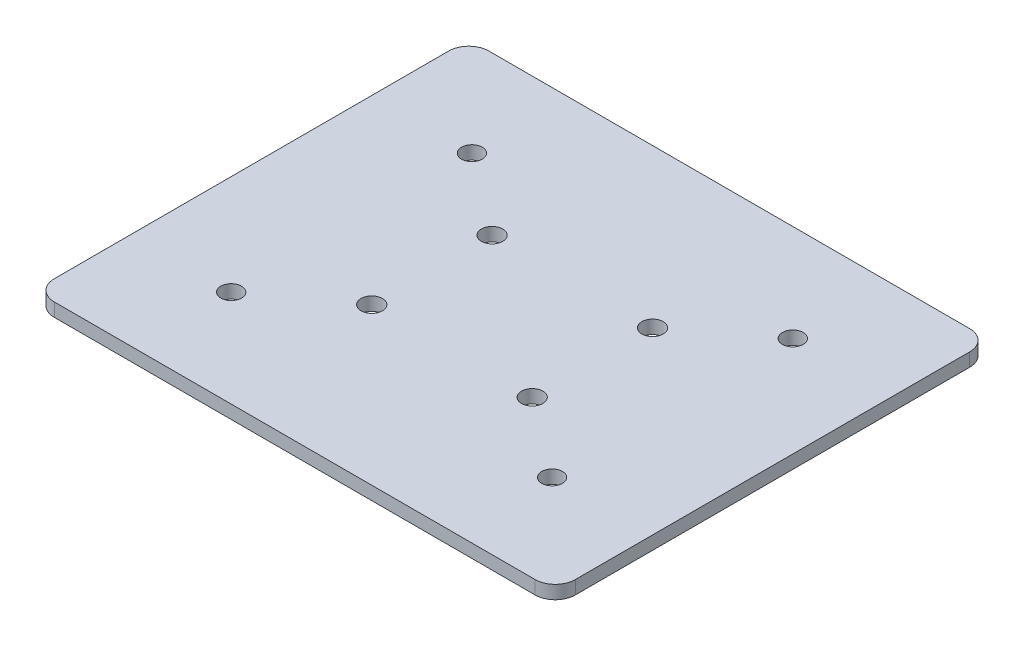
ISO-10303-21;
HEADER;
FILE_DESCRIPTION(('STEP AP214'),'2;1');
FILE_NAME('part.step','',(''),(''),'','','');
FILE_SCHEMA(('AUTOMOTIVE_DESIGN { 1 0 10303 214 1 1 1 1 }'));
ENDSEC;
DATA;
#1=APPLICATION_CONTEXT('core data for automotive mechanical design processes');
#2=APPLICATION_PROTOCOL_DEFINITION('international standard','automotive_design',2000,#1);
#3=PRODUCT_CONTEXT('',#1,'mechanical');
#4=PRODUCT('Part','Part','',(#3));
#5=PRODUCT_RELATED_PRODUCT_CATEGORY('part','',(#4));
#6=PRODUCT_DEFINITION_FORMATION('','',#4);
#7=PRODUCT_DEFINITION_CONTEXT('part definition',#1,'design');
#8=PRODUCT_DEFINITION('design','',#6,#7);
#9=PRODUCT_DEFINITION_SHAPE('','',#8);
#10=(LENGTH_UNIT() NAMED_UNIT(*) SI_UNIT(.MILLI.,.METRE.));
#11=(NAMED_UNIT(*) PLANE_ANGLE_UNIT() SI_UNIT($,.RADIAN.));
#12=(NAMED_UNIT(*) SI_UNIT($,.STERADIAN.) SOLID_ANGLE_UNIT());
#13=UNCERTAINTY_MEASURE_WITH_UNIT(LENGTH_MEASURE(1.E-05),#10,'distance_accuracy_value','');
#14=(GEOMETRIC_REPRESENTATION_CONTEXT(3) GLOBAL_UNCERTAINTY_ASSIGNED_CONTEXT((#13)) GLOBAL_UNIT_ASSIGNED_CONTEXT((#10,
#11,#12)) REPRESENTATION_CONTEXT('',''));
#15=CARTESIAN_POINT('',(0.,0.,0.));
#16=DIRECTION('',(0.,0.,1.));
#17=DIRECTION('',(1.,0.,0.));
#18=AXIS2_PLACEMENT_3D('',#15,#16,#17);
#19=CARTESIAN_POINT('',(-38.9641351282005,2.,32.5));
#20=DIRECTION('',(-1.,0.,0.));
#21=DIRECTION('',(0.,0.,1.));
#22=AXIS2_PLACEMENT_3D('',#19,#20,#21);
#23=PLANE('',#22);
#24=DIRECTION('',(0.,0.,-1.));
#25=VECTOR('',#24,1.);
#26=CARTESIAN_POINT('',(-38.9641351282005,0.,32.5));
#27=LINE('',#26,#25);
#28=CARTESIAN_POINT('',(-38.9641351282005,0.,29.5));
#29=VERTEX_POINT('',#28);
#30=CARTESIAN_POINT('',(-38.9641351282005,0.,-29.5));
#31=VERTEX_POINT('',#30);
#32=EDGE_CURVE('E190',#29,#31,#27,.T.);
#33=ORIENTED_EDGE('',*,*,#32,.F.);
#34=DIRECTION('',(0.,-1.,0.));
#35=VECTOR('',#34,1.);
#36=CARTESIAN_POINT('',(-38.9641351282005,2.,29.5));
#37=LINE('',#36,#35);
#38=CARTESIAN_POINT('',(-38.9641351282005,2.,29.5));
#39=VERTEX_POINT('',#38);
#40=EDGE_CURVE('E111',#29,#39,#37,.F.);
#41=ORIENTED_EDGE('',*,*,#40,.T.);
#42=DIRECTION('',(0.,0.,-1.));
#43=VECTOR('',#42,1.);
#44=CARTESIAN_POINT('',(-38.9641351282005,2.,32.5));
#45=LINE('',#44,#43);
#46=CARTESIAN_POINT('',(-38.9641351282005,2.,-29.5));
#47=VERTEX_POINT('',#46);
#48=EDGE_CURVE('E135',#39,#47,#45,.T.);
#49=ORIENTED_EDGE('',*,*,#48,.T.);
#50=DIRECTION('',(0.,-1.,0.));
#51=VECTOR('',#50,1.);
#52=CARTESIAN_POINT('',(-38.9641351282005,2.,-29.5));
#53=LINE('',#52,#51);
#54=EDGE_CURVE('E117',#47,#31,#53,.T.);
#55=ORIENTED_EDGE('',*,*,#54,.T.);
#56=EDGE_LOOP('',(#33,#41,#49,#55));
#57=FACE_BOUND('',#56,.T.);
#58=ADVANCED_FACE('F39',(#57),#23,.T.);
#59=CARTESIAN_POINT('',(-38.9641351282005,2.,32.5));
#60=DIRECTION('',(0.,0.,-1.));
#61=DIRECTION('',(-1.,0.,0.));
#62=AXIS2_PLACEMENT_3D('',#59,#60,#61);
#63=PLANE('',#62);
#64=DIRECTION('',(1.,0.,0.));
#65=VECTOR('',#64,1.);
#66=CARTESIAN_POINT('',(-38.9641351282005,2.,32.5));
#67=LINE('',#66,#65);
#68=CARTESIAN_POINT('',(-35.9641351282005,2.,32.5));
#69=VERTEX_POINT('',#68);
#70=CARTESIAN_POINT('',(35.9641351282005,2.,32.5));
#71=VERTEX_POINT('',#70);
#72=EDGE_CURVE('E127',#69,#71,#67,.T.);
#73=ORIENTED_EDGE('',*,*,#72,.F.);
#74=DIRECTION('',(0.,-1.,0.));
#75=VECTOR('',#74,1.);
#76=CARTESIAN_POINT('',(-35.9641351282005,0.,32.5));
#77=LINE('',#76,#75);
#78=CARTESIAN_POINT('',(-35.9641351282005,0.,32.5));
#79=VERTEX_POINT('',#78);
#80=EDGE_CURVE('E110',#69,#79,#77,.T.);
#81=ORIENTED_EDGE('',*,*,#80,.T.);
#82=DIRECTION('',(1.,0.,0.));
#83=VECTOR('',#82,1.);
#84=CARTESIAN_POINT('',(-38.9641351282005,0.,32.5));
#85=LINE('',#84,#83);
#86=CARTESIAN_POINT('',(35.9641351282005,0.,32.5));
#87=VERTEX_POINT('',#86);
#88=EDGE_CURVE('E124',#79,#87,#85,.T.);
#89=ORIENTED_EDGE('',*,*,#88,.T.);
#90=DIRECTION('',(0.,-1.,0.));
#91=VECTOR('',#90,1.);
#92=CARTESIAN_POINT('',(35.9641351282005,2.,32.5));
#93=LINE('',#92,#91);
#94=EDGE_CURVE('E130',#87,#71,#93,.F.);
#95=ORIENTED_EDGE('',*,*,#94,.T.);
#96=EDGE_LOOP('',(#73,#81,#89,#95));
#97=FACE_BOUND('',#96,.T.);
#98=ADVANCED_FACE('F123',(#97),#63,.F.);
#99=CARTESIAN_POINT('',(38.9641351282005,2.,32.5));
#100=DIRECTION('',(-1.,0.,0.));
#101=DIRECTION('',(0.,0.,1.));
#102=AXIS2_PLACEMENT_3D('',#99,#100,#101);
#103=PLANE('',#102);
#104=DIRECTION('',(0.,0.,-1.));
#105=VECTOR('',#104,1.);
#106=CARTESIAN_POINT('',(38.9641351282005,2.,32.5));
#107=LINE('',#106,#105);
#108=CARTESIAN_POINT('',(38.9641351282005,2.,29.5));
#109=VERTEX_POINT('',#108);
#110=CARTESIAN_POINT('',(38.9641351282005,2.,-29.5));
#111=VERTEX_POINT('',#110);
#112=EDGE_CURVE('E182',#109,#111,#107,.T.);
#113=ORIENTED_EDGE('',*,*,#112,.F.);
#114=DIRECTION('',(0.,-1.,0.));
#115=VECTOR('',#114,1.);
#116=CARTESIAN_POINT('',(38.9641351282005,2.,29.5));
#117=LINE('',#116,#115);
#118=CARTESIAN_POINT('',(38.9641351282005,0.,29.5));
#119=VERTEX_POINT('',#118);
#120=EDGE_CURVE('E176',#109,#119,#117,.T.);
#121=ORIENTED_EDGE('',*,*,#120,.T.);
#122=DIRECTION('',(0.,0.,-1.));
#123=VECTOR('',#122,1.);
#124=CARTESIAN_POINT('',(38.9641351282005,0.,32.5));
#125=LINE('',#124,#123);
#126=CARTESIAN_POINT('',(38.9641351282005,0.,-29.5));
#127=VERTEX_POINT('',#126);
#128=EDGE_CURVE('E136',#119,#127,#125,.T.);
#129=ORIENTED_EDGE('',*,*,#128,.T.);
#130=DIRECTION('',(0.,-1.,0.));
#131=VECTOR('',#130,1.);
#132=CARTESIAN_POINT('',(38.9641351282005,2.,-29.5));
#133=LINE('',#132,#131);
#134=EDGE_CURVE('E173',#127,#111,#133,.F.);
#135=ORIENTED_EDGE('',*,*,#134,.T.);
#136=EDGE_LOOP('',(#113,#121,#129,#135));
#137=FACE_BOUND('',#136,.T.);
#138=ADVANCED_FACE('F207',(#137),#103,.F.);
#139=CARTESIAN_POINT('',(-38.9641351282005,2.,-32.5));
#140=DIRECTION('',(0.,0.,-1.));
#141=DIRECTION('',(-1.,0.,0.));
#142=AXIS2_PLACEMENT_3D('',#139,#140,#141);
#143=PLANE('',#142);
#144=DIRECTION('',(1.,0.,0.));
#145=VECTOR('',#144,1.);
#146=CARTESIAN_POINT('',(-38.9641351282005,2.,-32.5));
#147=LINE('',#146,#145);
#148=CARTESIAN_POINT('',(-35.9641351282005,2.,-32.5));
#149=VERTEX_POINT('',#148);
#150=CARTESIAN_POINT('',(35.9641351282005,2.,-32.5));
#151=VERTEX_POINT('',#150);
#152=EDGE_CURVE('E141',#149,#151,#147,.T.);
#153=ORIENTED_EDGE('',*,*,#152,.T.);
#154=DIRECTION('',(0.,-1.,0.));
#155=VECTOR('',#154,1.);
#156=CARTESIAN_POINT('',(35.9641351282005,0.,-32.5));
#157=LINE('',#156,#155);
#158=CARTESIAN_POINT('',(35.9641351282005,0.,-32.5));
#159=VERTEX_POINT('',#158);
#160=EDGE_CURVE('E11',#151,#159,#157,.T.);
#161=ORIENTED_EDGE('',*,*,#160,.T.);
#162=DIRECTION('',(1.,0.,0.));
#163=VECTOR('',#162,1.);
#164=CARTESIAN_POINT('',(-38.9641351282005,0.,-32.5));
#165=LINE('',#164,#163);
#166=CARTESIAN_POINT('',(-35.9641351282005,0.,-32.5));
#167=VERTEX_POINT('',#166);
#168=EDGE_CURVE('E144',#167,#159,#165,.T.);
#169=ORIENTED_EDGE('',*,*,#168,.F.);
#170=DIRECTION('',(0.,-1.,0.));
#171=VECTOR('',#170,1.);
#172=CARTESIAN_POINT('',(-35.9641351282005,2.,-32.5));
#173=LINE('',#172,#171);
#174=EDGE_CURVE('E48',#167,#149,#173,.F.);
#175=ORIENTED_EDGE('',*,*,#174,.T.);
#176=EDGE_LOOP('',(#153,#161,#169,#175));
#177=FACE_BOUND('',#176,.T.);
#178=ADVANCED_FACE('F195',(#177),#143,.T.);
#179=CARTESIAN_POINT('',(0.,2.,0.));
#180=DIRECTION('',(0.,-1.,0.));
#181=DIRECTION('',(0.,0.,-1.));
#182=AXIS2_PLACEMENT_3D('',#179,#180,#181);
#183=PLANE('',#182);
#184=CARTESIAN_POINT('',(24.,2.,-18.));
#185=DIRECTION('',(0.,-1.,0.));
#186=DIRECTION('',(0.,0.,-1.));
#187=AXIS2_PLACEMENT_3D('',#184,#185,#186);
#188=CIRCLE('',#187,1.54999999999999);
#189=CARTESIAN_POINT('',(24.,2.,-19.55));
#190=VERTEX_POINT('',#189);
#191=EDGE_CURVE('E192',#190,#190,#188,.T.);
#192=ORIENTED_EDGE('',*,*,#191,.T.);
#193=EDGE_LOOP('',(#192));
#194=FACE_BOUND('',#193,.T.);
#195=CARTESIAN_POINT('',(24.,2.,18.));
#196=DIRECTION('',(0.,-1.,0.));
#197=DIRECTION('',(0.,0.,-1.));
#198=AXIS2_PLACEMENT_3D('',#195,#196,#197);
#199=CIRCLE('',#198,1.54999999999999);
#200=CARTESIAN_POINT('',(24.,2.,16.45));
#201=VERTEX_POINT('',#200);
#202=EDGE_CURVE('E297',#201,#201,#199,.T.);
#203=ORIENTED_EDGE('',*,*,#202,.T.);
#204=EDGE_LOOP('',(#203));
#205=FACE_BOUND('',#204,.T.);
#206=CARTESIAN_POINT('',(-24.,2.,18.));
#207=DIRECTION('',(0.,-1.,0.));
#208=DIRECTION('',(0.,0.,-1.));
#209=AXIS2_PLACEMENT_3D('',#206,#207,#208);
#210=CIRCLE('',#209,1.55);
#211=CARTESIAN_POINT('',(-24.,2.,16.45));
#212=VERTEX_POINT('',#211);
#213=EDGE_CURVE('E287',#212,#212,#210,.T.);
#214=ORIENTED_EDGE('',*,*,#213,.T.);
#215=EDGE_LOOP('',(#214));
#216=FACE_BOUND('',#215,.T.);
#217=CARTESIAN_POINT('',(-11.8650429657972,2.,-8.88743228619964));
#218=DIRECTION('',(0.,-1.,0.));
#219=DIRECTION('',(0.,0.,-1.));
#220=AXIS2_PLACEMENT_3D('',#217,#218,#219);
#221=CIRCLE('',#220,1.6);
#222=CARTESIAN_POINT('',(-11.8650429657972,2.,-10.4874322861996));
#223=VERTEX_POINT('',#222);
#224=EDGE_CURVE('E281',#223,#223,#221,.T.);
#225=ORIENTED_EDGE('',*,*,#224,.T.);
#226=EDGE_LOOP('',(#225));
#227=FACE_BOUND('',#226,.T.);
#228=CARTESIAN_POINT('',(12.1349570342028,2.,-8.88743228619964));
#229=DIRECTION('',(0.,-1.,0.));
#230=DIRECTION('',(0.,0.,-1.));
#231=AXIS2_PLACEMENT_3D('',#228,#229,#230);
#232=CIRCLE('',#231,1.6);
#233=CARTESIAN_POINT('',(12.1349570342028,2.,-10.4874322861996));
#234=VERTEX_POINT('',#233);
#235=EDGE_CURVE('E278',#234,#234,#232,.T.);
#236=ORIENTED_EDGE('',*,*,#235,.T.);
#237=EDGE_LOOP('',(#236));
#238=FACE_BOUND('',#237,.T.);
#239=CARTESIAN_POINT('',(12.1349570342028,2.,9.11256771380036));
#240=DIRECTION('',(0.,-1.,0.));
#241=DIRECTION('',(0.,0.,-1.));
#242=AXIS2_PLACEMENT_3D('',#239,#240,#241);
#243=CIRCLE('',#242,1.6);
#244=CARTESIAN_POINT('',(12.1349570342028,2.,7.51256771380036));
#245=VERTEX_POINT('',#244);
#246=EDGE_CURVE('E282',#245,#245,#243,.T.);
#247=ORIENTED_EDGE('',*,*,#246,.T.);
#248=EDGE_LOOP('',(#247));
#249=FACE_BOUND('',#248,.T.);
#250=CARTESIAN_POINT('',(-11.8650429657972,2.,9.11256771380036));
#251=DIRECTION('',(0.,-1.,0.));
#252=DIRECTION('',(0.,0.,-1.));
#253=AXIS2_PLACEMENT_3D('',#250,#251,#252);
#254=CIRCLE('',#253,1.6);
#255=CARTESIAN_POINT('',(-11.8650429657972,2.,7.51256771380036));
#256=VERTEX_POINT('',#255);
#257=EDGE_CURVE('E290',#256,#256,#254,.T.);
#258=ORIENTED_EDGE('',*,*,#257,.T.);
#259=EDGE_LOOP('',(#258));
#260=FACE_BOUND('',#259,.T.);
#261=CARTESIAN_POINT('',(-24.,2.,-18.));
#262=DIRECTION('',(0.,-1.,0.));
#263=DIRECTION('',(0.,0.,-1.));
#264=AXIS2_PLACEMENT_3D('',#261,#262,#263);
#265=CIRCLE('',#264,1.55);
#266=CARTESIAN_POINT('',(-24.,2.,-19.55));
#267=VERTEX_POINT('',#266);
#268=EDGE_CURVE('E318',#267,#267,#265,.T.);
#269=ORIENTED_EDGE('',*,*,#268,.T.);
#270=EDGE_LOOP('',(#269));
#271=FACE_BOUND('',#270,.T.);
#272=ORIENTED_EDGE('',*,*,#48,.F.);
#273=CARTESIAN_POINT('',(-35.9641351282005,2.,29.5));
#274=DIRECTION('',(0.,-1.,0.));
#275=DIRECTION('',(0.,0.,-1.));
#276=AXIS2_PLACEMENT_3D('',#273,#274,#275);
#277=CIRCLE('',#276,3.);
#278=EDGE_CURVE('E170',#39,#69,#277,.F.);
#279=ORIENTED_EDGE('',*,*,#278,.T.);
#280=ORIENTED_EDGE('',*,*,#72,.T.);
#281=CARTESIAN_POINT('',(35.9641351282005,2.,29.5));
#282=DIRECTION('',(0.,-1.,0.));
#283=DIRECTION('',(0.,0.,-1.));
#284=AXIS2_PLACEMENT_3D('',#281,#282,#283);
#285=CIRCLE('',#284,3.);
#286=EDGE_CURVE('E167',#71,#109,#285,.F.);
#287=ORIENTED_EDGE('',*,*,#286,.T.);
#288=ORIENTED_EDGE('',*,*,#112,.T.);
#289=CARTESIAN_POINT('',(35.9641351282005,2.,-29.5));
#290=DIRECTION('',(0.,-1.,0.));
#291=DIRECTION('',(0.,0.,-1.));
#292=AXIS2_PLACEMENT_3D('',#289,#290,#291);
#293=CIRCLE('',#292,3.);
#294=EDGE_CURVE('E55',#111,#151,#293,.F.);
#295=ORIENTED_EDGE('',*,*,#294,.T.);
#296=ORIENTED_EDGE('',*,*,#152,.F.);
#297=CARTESIAN_POINT('',(-35.9641351282005,2.,-29.5));
#298=DIRECTION('',(0.,-1.,0.));
#299=DIRECTION('',(0.,0.,-1.));
#300=AXIS2_PLACEMENT_3D('',#297,#298,#299);
#301=CIRCLE('',#300,3.);
#302=EDGE_CURVE('E162',#149,#47,#301,.F.);
#303=ORIENTED_EDGE('',*,*,#302,.T.);
#304=EDGE_LOOP('',(#272,#279,#280,#287,#288,#295,#296,#303));
#305=FACE_BOUND('',#304,.T.);
#306=ADVANCED_FACE('F200',(#194,#205,#216,#227,#238,#249,#260,#271,#305),#183,.F.);
#307=CARTESIAN_POINT('',(0.,0.,0.));
#308=DIRECTION('',(0.,-1.,0.));
#309=DIRECTION('',(0.,0.,-1.));
#310=AXIS2_PLACEMENT_3D('',#307,#308,#309);
#311=PLANE('',#310);
#312=CARTESIAN_POINT('',(24.,0.,-18.));
#313=DIRECTION('',(0.,1.,0.));
#314=DIRECTION('',(0.,0.,1.));
#315=AXIS2_PLACEMENT_3D('',#312,#313,#314);
#316=CIRCLE('',#315,1.54999999999999);
#317=CARTESIAN_POINT('',(24.,0.,-16.45));
#318=VERTEX_POINT('',#317);
#319=EDGE_CURVE('E326',#318,#318,#316,.T.);
#320=ORIENTED_EDGE('',*,*,#319,.T.);
#321=EDGE_LOOP('',(#320));
#322=FACE_BOUND('',#321,.T.);
#323=CARTESIAN_POINT('',(24.,0.,18.));
#324=DIRECTION('',(0.,1.,0.));
#325=DIRECTION('',(0.,0.,1.));
#326=AXIS2_PLACEMENT_3D('',#323,#324,#325);
#327=CIRCLE('',#326,1.54999999999999);
#328=CARTESIAN_POINT('',(24.,0.,19.55));
#329=VERTEX_POINT('',#328);
#330=EDGE_CURVE('E337',#329,#329,#327,.T.);
#331=ORIENTED_EDGE('',*,*,#330,.T.);
#332=EDGE_LOOP('',(#331));
#333=FACE_BOUND('',#332,.T.);
#334=CARTESIAN_POINT('',(-24.,0.,18.));
#335=DIRECTION('',(0.,1.,0.));
#336=DIRECTION('',(0.,0.,1.));
#337=AXIS2_PLACEMENT_3D('',#334,#335,#336);
#338=CIRCLE('',#337,1.55);
#339=CARTESIAN_POINT('',(-24.,0.,19.55));
#340=VERTEX_POINT('',#339);
#341=EDGE_CURVE('E333',#340,#340,#338,.T.);
#342=ORIENTED_EDGE('',*,*,#341,.T.);
#343=EDGE_LOOP('',(#342));
#344=FACE_BOUND('',#343,.T.);
#345=CARTESIAN_POINT('',(-11.8650429657972,0.,-8.88743228619964));
#346=DIRECTION('',(0.,1.,0.));
#347=DIRECTION('',(0.,0.,1.));
#348=AXIS2_PLACEMENT_3D('',#345,#346,#347);
#349=CIRCLE('',#348,1.6);
#350=CARTESIAN_POINT('',(-11.8650429657972,0.,-7.28743228619964));
#351=VERTEX_POINT('',#350);
#352=EDGE_CURVE('E329',#351,#351,#349,.T.);
#353=ORIENTED_EDGE('',*,*,#352,.T.);
#354=EDGE_LOOP('',(#353));
#355=FACE_BOUND('',#354,.T.);
#356=CARTESIAN_POINT('',(12.1349570342028,0.,-8.88743228619964));
#357=DIRECTION('',(0.,1.,0.));
#358=DIRECTION('',(0.,0.,1.));
#359=AXIS2_PLACEMENT_3D('',#356,#357,#358);
#360=CIRCLE('',#359,1.6);
#361=CARTESIAN_POINT('',(12.1349570342028,0.,-7.28743228619964));
#362=VERTEX_POINT('',#361);
#363=EDGE_CURVE('E275',#362,#362,#360,.T.);
#364=ORIENTED_EDGE('',*,*,#363,.T.);
#365=EDGE_LOOP('',(#364));
#366=FACE_BOUND('',#365,.T.);
#367=CARTESIAN_POINT('',(12.1349570342028,0.,9.11256771380036));
#368=DIRECTION('',(0.,1.,0.));
#369=DIRECTION('',(0.,0.,1.));
#370=AXIS2_PLACEMENT_3D('',#367,#368,#369);
#371=CIRCLE('',#370,1.6);
#372=CARTESIAN_POINT('',(12.1349570342028,0.,10.7125677138004));
#373=VERTEX_POINT('',#372);
#374=EDGE_CURVE('E348',#373,#373,#371,.T.);
#375=ORIENTED_EDGE('',*,*,#374,.T.);
#376=EDGE_LOOP('',(#375));
#377=FACE_BOUND('',#376,.T.);
#378=CARTESIAN_POINT('',(-11.8650429657972,0.,9.11256771380036));
#379=DIRECTION('',(0.,1.,0.));
#380=DIRECTION('',(0.,0.,1.));
#381=AXIS2_PLACEMENT_3D('',#378,#379,#380);
#382=CIRCLE('',#381,1.6);
#383=CARTESIAN_POINT('',(-11.8650429657972,0.,10.7125677138004));
#384=VERTEX_POINT('',#383);
#385=EDGE_CURVE('E344',#384,#384,#382,.T.);
#386=ORIENTED_EDGE('',*,*,#385,.T.);
#387=EDGE_LOOP('',(#386));
#388=FACE_BOUND('',#387,.T.);
#389=CARTESIAN_POINT('',(-24.,0.,-18.));
#390=DIRECTION('',(0.,1.,0.));
#391=DIRECTION('',(0.,0.,1.));
#392=AXIS2_PLACEMENT_3D('',#389,#390,#391);
#393=CIRCLE('',#392,1.55);
#394=CARTESIAN_POINT('',(-24.,0.,-16.45));
#395=VERTEX_POINT('',#394);
#396=EDGE_CURVE('E321',#395,#395,#393,.T.);
#397=ORIENTED_EDGE('',*,*,#396,.T.);
#398=EDGE_LOOP('',(#397));
#399=FACE_BOUND('',#398,.T.);
#400=ORIENTED_EDGE('',*,*,#88,.F.);
#401=CARTESIAN_POINT('',(-35.9641351282005,0.,29.5));
#402=DIRECTION('',(0.,-1.,0.));
#403=DIRECTION('',(0.,0.,-1.));
#404=AXIS2_PLACEMENT_3D('',#401,#402,#403);
#405=CIRCLE('',#404,3.);
#406=EDGE_CURVE('E106',#79,#29,#405,.T.);
#407=ORIENTED_EDGE('',*,*,#406,.T.);
#408=ORIENTED_EDGE('',*,*,#32,.T.);
#409=CARTESIAN_POINT('',(-35.9641351282005,0.,-29.5));
#410=DIRECTION('',(0.,-1.,0.));
#411=DIRECTION('',(0.,0.,-1.));
#412=AXIS2_PLACEMENT_3D('',#409,#410,#411);
#413=CIRCLE('',#412,3.);
#414=EDGE_CURVE('E129',#31,#167,#413,.T.);
#415=ORIENTED_EDGE('',*,*,#414,.T.);
#416=ORIENTED_EDGE('',*,*,#168,.T.);
#417=CARTESIAN_POINT('',(35.9641351282005,0.,-29.5));
#418=DIRECTION('',(0.,-1.,0.));
#419=DIRECTION('',(0.,0.,-1.));
#420=AXIS2_PLACEMENT_3D('',#417,#418,#419);
#421=CIRCLE('',#420,3.);
#422=EDGE_CURVE('E152',#159,#127,#421,.T.);
#423=ORIENTED_EDGE('',*,*,#422,.T.);
#424=ORIENTED_EDGE('',*,*,#128,.F.);
#425=CARTESIAN_POINT('',(35.9641351282005,0.,29.5));
#426=DIRECTION('',(0.,-1.,0.));
#427=DIRECTION('',(0.,0.,-1.));
#428=AXIS2_PLACEMENT_3D('',#425,#426,#427);
#429=CIRCLE('',#428,3.);
#430=EDGE_CURVE('E118',#119,#87,#429,.T.);
#431=ORIENTED_EDGE('',*,*,#430,.T.);
#432=EDGE_LOOP('',(#400,#407,#408,#415,#416,#423,#424,#431));
#433=FACE_BOUND('',#432,.T.);
#434=ADVANCED_FACE('F132',(#322,#333,#344,#355,#366,#377,#388,#399,#433),#311,.T.);
#435=CARTESIAN_POINT('',(-24.,0.,-18.));
#436=DIRECTION('',(0.,1.,0.));
#437=DIRECTION('',(0.,0.,1.));
#438=AXIS2_PLACEMENT_3D('',#435,#436,#437);
#439=CYLINDRICAL_SURFACE('',#438,1.55);
#440=ORIENTED_EDGE('',*,*,#396,.F.);
#441=EDGE_LOOP('',(#440));
#442=FACE_BOUND('',#441,.T.);
#443=ORIENTED_EDGE('',*,*,#268,.F.);
#444=EDGE_LOOP('',(#443));
#445=FACE_BOUND('',#444,.T.);
#446=ADVANCED_FACE('F236',(#442,#445),#439,.F.);
#447=CARTESIAN_POINT('',(-11.8650429657972,0.,9.11256771380036));
#448=DIRECTION('',(0.,1.,0.));
#449=DIRECTION('',(0.,0.,1.));
#450=AXIS2_PLACEMENT_3D('',#447,#448,#449);
#451=CYLINDRICAL_SURFACE('',#450,1.6);
#452=ORIENTED_EDGE('',*,*,#385,.F.);
#453=EDGE_LOOP('',(#452));
#454=FACE_BOUND('',#453,.T.);
#455=ORIENTED_EDGE('',*,*,#257,.F.);
#456=EDGE_LOOP('',(#455));
#457=FACE_BOUND('',#456,.T.);
#458=ADVANCED_FACE('F243',(#454,#457),#451,.F.);
#459=CARTESIAN_POINT('',(12.1349570342028,0.,9.11256771380036));
#460=DIRECTION('',(0.,1.,0.));
#461=DIRECTION('',(0.,0.,1.));
#462=AXIS2_PLACEMENT_3D('',#459,#460,#461);
#463=CYLINDRICAL_SURFACE('',#462,1.6);
#464=ORIENTED_EDGE('',*,*,#374,.F.);
#465=EDGE_LOOP('',(#464));
#466=FACE_BOUND('',#465,.T.);
#467=ORIENTED_EDGE('',*,*,#246,.F.);
#468=EDGE_LOOP('',(#467));
#469=FACE_BOUND('',#468,.T.);
#470=ADVANCED_FACE('F263',(#466,#469),#463,.F.);
#471=CARTESIAN_POINT('',(12.1349570342028,0.,-8.88743228619964));
#472=DIRECTION('',(0.,1.,0.));
#473=DIRECTION('',(0.,0.,1.));
#474=AXIS2_PLACEMENT_3D('',#471,#472,#473);
#475=CYLINDRICAL_SURFACE('',#474,1.6);
#476=ORIENTED_EDGE('',*,*,#363,.F.);
#477=EDGE_LOOP('',(#476));
#478=FACE_BOUND('',#477,.T.);
#479=ORIENTED_EDGE('',*,*,#235,.F.);
#480=EDGE_LOOP('',(#479));
#481=FACE_BOUND('',#480,.T.);
#482=ADVANCED_FACE('F249',(#478,#481),#475,.F.);
#483=CARTESIAN_POINT('',(-11.8650429657972,0.,-8.88743228619964));
#484=DIRECTION('',(0.,1.,0.));
#485=DIRECTION('',(0.,0.,1.));
#486=AXIS2_PLACEMENT_3D('',#483,#484,#485);
#487=CYLINDRICAL_SURFACE('',#486,1.6);
#488=ORIENTED_EDGE('',*,*,#352,.F.);
#489=EDGE_LOOP('',(#488));
#490=FACE_BOUND('',#489,.T.);
#491=ORIENTED_EDGE('',*,*,#224,.F.);
#492=EDGE_LOOP('',(#491));
#493=FACE_BOUND('',#492,.T.);
#494=ADVANCED_FACE('F245',(#490,#493),#487,.F.);
#495=CARTESIAN_POINT('',(-24.,0.,18.));
#496=DIRECTION('',(0.,1.,0.));
#497=DIRECTION('',(0.,0.,1.));
#498=AXIS2_PLACEMENT_3D('',#495,#496,#497);
#499=CYLINDRICAL_SURFACE('',#498,1.55);
#500=ORIENTED_EDGE('',*,*,#341,.F.);
#501=EDGE_LOOP('',(#500));
#502=FACE_BOUND('',#501,.T.);
#503=ORIENTED_EDGE('',*,*,#213,.F.);
#504=EDGE_LOOP('',(#503));
#505=FACE_BOUND('',#504,.T.);
#506=ADVANCED_FACE('F248',(#502,#505),#499,.F.);
#507=CARTESIAN_POINT('',(24.,0.,18.));
#508=DIRECTION('',(0.,1.,0.));
#509=DIRECTION('',(0.,0.,1.));
#510=AXIS2_PLACEMENT_3D('',#507,#508,#509);
#511=CYLINDRICAL_SURFACE('',#510,1.54999999999999);
#512=ORIENTED_EDGE('',*,*,#330,.F.);
#513=EDGE_LOOP('',(#512));
#514=FACE_BOUND('',#513,.T.);
#515=ORIENTED_EDGE('',*,*,#202,.F.);
#516=EDGE_LOOP('',(#515));
#517=FACE_BOUND('',#516,.T.);
#518=ADVANCED_FACE('F253',(#514,#517),#511,.F.);
#519=CARTESIAN_POINT('',(24.,0.,-18.));
#520=DIRECTION('',(0.,1.,0.));
#521=DIRECTION('',(0.,0.,1.));
#522=AXIS2_PLACEMENT_3D('',#519,#520,#521);
#523=CYLINDRICAL_SURFACE('',#522,1.54999999999999);
#524=ORIENTED_EDGE('',*,*,#319,.F.);
#525=EDGE_LOOP('',(#524));
#526=FACE_BOUND('',#525,.T.);
#527=ORIENTED_EDGE('',*,*,#191,.F.);
#528=EDGE_LOOP('',(#527));
#529=FACE_BOUND('',#528,.T.);
#530=ADVANCED_FACE('F215',(#526,#529),#523,.F.);
#531=CARTESIAN_POINT('',(-35.9641351282005,2.,29.5));
#532=DIRECTION('',(0.,1.,0.));
#533=DIRECTION('',(0.,0.,1.));
#534=AXIS2_PLACEMENT_3D('',#531,#532,#533);
#535=CYLINDRICAL_SURFACE('',#534,3.);
#536=ORIENTED_EDGE('',*,*,#278,.F.);
#537=ORIENTED_EDGE('',*,*,#40,.F.);
#538=ORIENTED_EDGE('',*,*,#406,.F.);
#539=ORIENTED_EDGE('',*,*,#80,.F.);
#540=EDGE_LOOP('',(#536,#537,#538,#539));
#541=FACE_BOUND('',#540,.T.);
#542=ADVANCED_FACE('F109',(#541),#535,.T.);
#543=CARTESIAN_POINT('',(35.9641351282005,2.,29.5));
#544=DIRECTION('',(0.,-1.,0.));
#545=DIRECTION('',(0.,0.,-1.));
#546=AXIS2_PLACEMENT_3D('',#543,#544,#545);
#547=CYLINDRICAL_SURFACE('',#546,3.);
#548=ORIENTED_EDGE('',*,*,#286,.F.);
#549=ORIENTED_EDGE('',*,*,#94,.F.);
#550=ORIENTED_EDGE('',*,*,#430,.F.);
#551=ORIENTED_EDGE('',*,*,#120,.F.);
#552=EDGE_LOOP('',(#548,#549,#550,#551));
#553=FACE_BOUND('',#552,.T.);
#554=ADVANCED_FACE('F214',(#553),#547,.T.);
#555=CARTESIAN_POINT('',(35.9641351282005,2.,-29.5));
#556=DIRECTION('',(0.,1.,0.));
#557=DIRECTION('',(0.,0.,1.));
#558=AXIS2_PLACEMENT_3D('',#555,#556,#557);
#559=CYLINDRICAL_SURFACE('',#558,3.);
#560=ORIENTED_EDGE('',*,*,#294,.F.);
#561=ORIENTED_EDGE('',*,*,#134,.F.);
#562=ORIENTED_EDGE('',*,*,#422,.F.);
#563=ORIENTED_EDGE('',*,*,#160,.F.);
#564=EDGE_LOOP('',(#560,#561,#562,#563));
#565=FACE_BOUND('',#564,.T.);
#566=ADVANCED_FACE('F217',(#565),#559,.T.);
#567=CARTESIAN_POINT('',(-35.9641351282005,2.,-29.5));
#568=DIRECTION('',(0.,-1.,0.));
#569=DIRECTION('',(0.,0.,-1.));
#570=AXIS2_PLACEMENT_3D('',#567,#568,#569);
#571=CYLINDRICAL_SURFACE('',#570,3.);
#572=ORIENTED_EDGE('',*,*,#302,.F.);
#573=ORIENTED_EDGE('',*,*,#174,.F.);
#574=ORIENTED_EDGE('',*,*,#414,.F.);
#575=ORIENTED_EDGE('',*,*,#54,.F.);
#576=EDGE_LOOP('',(#572,#573,#574,#575));
#577=FACE_BOUND('',#576,.T.);
#578=ADVANCED_FACE('F41',(#577),#571,.T.);
#579=CLOSED_SHELL('',(#58,#98,#138,#178,#306,#434,#446,#458,#470,#482,#494,#506,#518,#530,#542,
#554,#566,#578));
#580=MANIFOLD_SOLID_BREP('B2',#579);
#581=ADVANCED_BREP_SHAPE_REPRESENTATION('',(#18,#580),#14);
#582=SHAPE_DEFINITION_REPRESENTATION(#9,#581);
ENDSEC;
END-ISO-10303-21;
